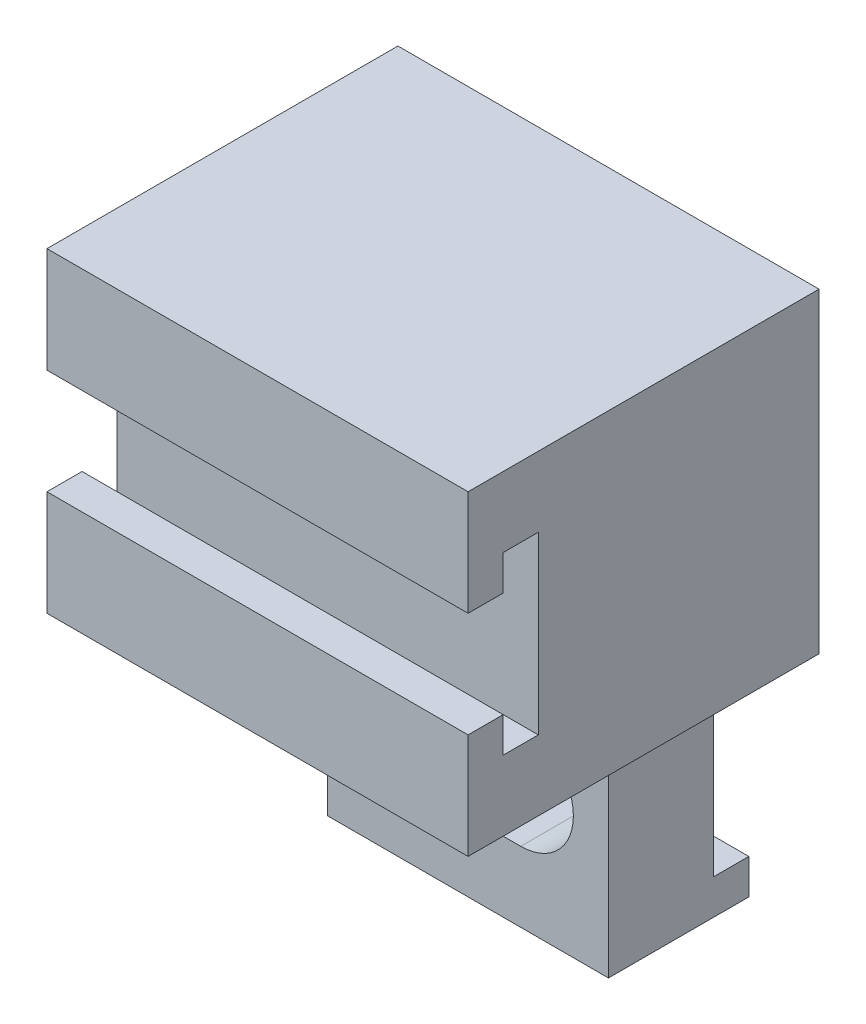
ISO-10303-21;
HEADER;
FILE_DESCRIPTION(('STEP AP214'),'2;1');
FILE_NAME('part.step','',(''),(''),'','','');
FILE_SCHEMA(('AUTOMOTIVE_DESIGN { 1 0 10303 214 1 1 1 1 }'));
ENDSEC;
DATA;
#1=APPLICATION_CONTEXT('core data for automotive mechanical design processes');
#2=APPLICATION_PROTOCOL_DEFINITION('international standard','automotive_design',2000,#1);
#3=PRODUCT_CONTEXT('',#1,'mechanical');
#4=PRODUCT('Part','Part','',(#3));
#5=PRODUCT_RELATED_PRODUCT_CATEGORY('part','',(#4));
#6=PRODUCT_DEFINITION_FORMATION('','',#4);
#7=PRODUCT_DEFINITION_CONTEXT('part definition',#1,'design');
#8=PRODUCT_DEFINITION('design','',#6,#7);
#9=PRODUCT_DEFINITION_SHAPE('','',#8);
#10=(LENGTH_UNIT() NAMED_UNIT(*) SI_UNIT(.MILLI.,.METRE.));
#11=(NAMED_UNIT(*) PLANE_ANGLE_UNIT() SI_UNIT($,.RADIAN.));
#12=(NAMED_UNIT(*) SI_UNIT($,.STERADIAN.) SOLID_ANGLE_UNIT());
#13=UNCERTAINTY_MEASURE_WITH_UNIT(LENGTH_MEASURE(1.E-05),#10,'distance_accuracy_value','');
#14=(GEOMETRIC_REPRESENTATION_CONTEXT(3) GLOBAL_UNCERTAINTY_ASSIGNED_CONTEXT((#13)) GLOBAL_UNIT_ASSIGNED_CONTEXT((#10,
#11,#12)) REPRESENTATION_CONTEXT('',''));
#15=CARTESIAN_POINT('',(0.,0.,0.));
#16=DIRECTION('',(0.,0.,1.));
#17=DIRECTION('',(1.,0.,0.));
#18=AXIS2_PLACEMENT_3D('',#15,#16,#17);
#19=CARTESIAN_POINT('',(60.,0.,100.));
#20=DIRECTION('',(0.,0.,-1.));
#21=DIRECTION('',(-1.,0.,0.));
#22=AXIS2_PLACEMENT_3D('',#19,#20,#21);
#23=PLANE('',#22);
#24=DIRECTION('',(0.,-1.,0.));
#25=VECTOR('',#24,1.);
#26=CARTESIAN_POINT('',(-60.,0.,100.));
#27=LINE('',#26,#25);
#28=CARTESIAN_POINT('',(-60.,100.,100.));
#29=VERTEX_POINT('',#28);
#30=CARTESIAN_POINT('',(-60.,70.,100.));
#31=VERTEX_POINT('',#30);
#32=EDGE_CURVE('E281',#29,#31,#27,.T.);
#33=ORIENTED_EDGE('',*,*,#32,.T.);
#34=DIRECTION('',(-1.,0.,0.));
#35=VECTOR('',#34,1.);
#36=CARTESIAN_POINT('',(60.,70.,100.));
#37=LINE('',#36,#35);
#38=CARTESIAN_POINT('',(60.,70.,100.));
#39=VERTEX_POINT('',#38);
#40=EDGE_CURVE('E366',#39,#31,#37,.T.);
#41=ORIENTED_EDGE('',*,*,#40,.F.);
#42=DIRECTION('',(0.,-1.,0.));
#43=VECTOR('',#42,1.);
#44=CARTESIAN_POINT('',(60.,0.,100.));
#45=LINE('',#44,#43);
#46=CARTESIAN_POINT('',(60.,100.,100.));
#47=VERTEX_POINT('',#46);
#48=EDGE_CURVE('E282',#47,#39,#45,.T.);
#49=ORIENTED_EDGE('',*,*,#48,.F.);
#50=DIRECTION('',(-1.,0.,0.));
#51=VECTOR('',#50,1.);
#52=CARTESIAN_POINT('',(60.,100.,100.));
#53=LINE('',#52,#51);
#54=EDGE_CURVE('E308',#47,#29,#53,.T.);
#55=ORIENTED_EDGE('',*,*,#54,.T.);
#56=EDGE_LOOP('',(#33,#41,#49,#55));
#57=FACE_BOUND('',#56,.T.);
#58=ADVANCED_FACE('F39',(#57),#23,.F.);
#59=CARTESIAN_POINT('',(60.,70.,0.));
#60=DIRECTION('',(0.,1.,0.));
#61=DIRECTION('',(0.,0.,1.));
#62=AXIS2_PLACEMENT_3D('',#59,#60,#61);
#63=PLANE('',#62);
#64=DIRECTION('',(-1.,0.,0.));
#65=VECTOR('',#64,1.);
#66=CARTESIAN_POINT('',(60.,70.,0.));
#67=LINE('',#66,#65);
#68=CARTESIAN_POINT('',(-40.,70.,0.));
#69=VERTEX_POINT('',#68);
#70=CARTESIAN_POINT('',(-60.,70.,0.));
#71=VERTEX_POINT('',#70);
#72=EDGE_CURVE('E362',#69,#71,#67,.T.);
#73=ORIENTED_EDGE('',*,*,#72,.F.);
#74=DIRECTION('',(0.,0.,1.));
#75=VECTOR('',#74,1.);
#76=CARTESIAN_POINT('',(-40.,70.,0.));
#77=LINE('',#76,#75);
#78=CARTESIAN_POINT('',(-40.,70.,40.));
#79=VERTEX_POINT('',#78);
#80=EDGE_CURVE('E228',#69,#79,#77,.T.);
#81=ORIENTED_EDGE('',*,*,#80,.T.);
#82=DIRECTION('',(-1.,0.,0.));
#83=VECTOR('',#82,1.);
#84=CARTESIAN_POINT('',(40.,70.,40.));
#85=LINE('',#84,#83);
#86=CARTESIAN_POINT('',(40.,70.,40.));
#87=VERTEX_POINT('',#86);
#88=EDGE_CURVE('E244',#87,#79,#85,.T.);
#89=ORIENTED_EDGE('',*,*,#88,.F.);
#90=DIRECTION('',(0.,0.,1.));
#91=VECTOR('',#90,1.);
#92=CARTESIAN_POINT('',(40.,70.,0.));
#93=LINE('',#92,#91);
#94=CARTESIAN_POINT('',(40.,70.,0.));
#95=VERTEX_POINT('',#94);
#96=EDGE_CURVE('E241',#95,#87,#93,.T.);
#97=ORIENTED_EDGE('',*,*,#96,.F.);
#98=CARTESIAN_POINT('',(60.,70.,0.));
#99=VERTEX_POINT('',#98);
#100=EDGE_CURVE('E363',#99,#95,#67,.T.);
#101=ORIENTED_EDGE('',*,*,#100,.F.);
#102=DIRECTION('',(0.,0.,-1.));
#103=VECTOR('',#102,1.);
#104=CARTESIAN_POINT('',(60.,70.,0.));
#105=LINE('',#104,#103);
#106=EDGE_CURVE('E285',#39,#99,#105,.T.);
#107=ORIENTED_EDGE('',*,*,#106,.F.);
#108=ORIENTED_EDGE('',*,*,#40,.T.);
#109=DIRECTION('',(0.,0.,-1.));
#110=VECTOR('',#109,1.);
#111=CARTESIAN_POINT('',(-60.,70.,0.));
#112=LINE('',#111,#110);
#113=EDGE_CURVE('E311',#31,#71,#112,.T.);
#114=ORIENTED_EDGE('',*,*,#113,.T.);
#115=EDGE_LOOP('',(#73,#81,#89,#97,#101,#107,#108,#114));
#116=FACE_BOUND('',#115,.T.);
#117=ADVANCED_FACE('F398',(#116),#63,.F.);
#118=CARTESIAN_POINT('',(60.,0.,0.));
#119=DIRECTION('',(0.,0.,1.));
#120=DIRECTION('',(1.,0.,0.));
#121=AXIS2_PLACEMENT_3D('',#118,#119,#120);
#122=PLANE('',#121);
#123=DIRECTION('',(0.,1.,0.));
#124=VECTOR('',#123,1.);
#125=CARTESIAN_POINT('',(-60.,0.,0.));
#126=LINE('',#125,#124);
#127=CARTESIAN_POINT('',(-60.,160.,0.));
#128=VERTEX_POINT('',#127);
#129=EDGE_CURVE('E314',#71,#128,#126,.T.);
#130=ORIENTED_EDGE('',*,*,#129,.T.);
#131=DIRECTION('',(-1.,0.,0.));
#132=VECTOR('',#131,1.);
#133=CARTESIAN_POINT('',(60.,160.,0.));
#134=LINE('',#133,#132);
#135=CARTESIAN_POINT('',(60.,160.,0.));
#136=VERTEX_POINT('',#135);
#137=EDGE_CURVE('E359',#136,#128,#134,.T.);
#138=ORIENTED_EDGE('',*,*,#137,.F.);
#139=DIRECTION('',(0.,1.,0.));
#140=VECTOR('',#139,1.);
#141=CARTESIAN_POINT('',(60.,0.,0.));
#142=LINE('',#141,#140);
#143=EDGE_CURVE('E288',#99,#136,#142,.T.);
#144=ORIENTED_EDGE('',*,*,#143,.F.);
#145=ORIENTED_EDGE('',*,*,#100,.T.);
#146=DIRECTION('',(0.,1.,0.));
#147=VECTOR('',#146,1.);
#148=CARTESIAN_POINT('',(40.,0.,0.));
#149=LINE('',#148,#147);
#150=CARTESIAN_POINT('',(40.,60.,0.));
#151=VERTEX_POINT('',#150);
#152=EDGE_CURVE('E238',#151,#95,#149,.T.);
#153=ORIENTED_EDGE('',*,*,#152,.F.);
#154=DIRECTION('',(-1.,0.,0.));
#155=VECTOR('',#154,1.);
#156=CARTESIAN_POINT('',(40.,60.,0.));
#157=LINE('',#156,#155);
#158=CARTESIAN_POINT('',(-40.,60.,0.));
#159=VERTEX_POINT('',#158);
#160=EDGE_CURVE('E263',#151,#159,#157,.T.);
#161=ORIENTED_EDGE('',*,*,#160,.T.);
#162=DIRECTION('',(0.,1.,0.));
#163=VECTOR('',#162,1.);
#164=CARTESIAN_POINT('',(-40.,0.,0.));
#165=LINE('',#164,#163);
#166=EDGE_CURVE('E257',#159,#69,#165,.T.);
#167=ORIENTED_EDGE('',*,*,#166,.T.);
#168=ORIENTED_EDGE('',*,*,#72,.T.);
#169=EDGE_LOOP('',(#130,#138,#144,#145,#153,#161,#167,#168));
#170=FACE_BOUND('',#169,.T.);
#171=ADVANCED_FACE('F404',(#170),#122,.F.);
#172=CARTESIAN_POINT('',(60.,160.,0.));
#173=DIRECTION('',(0.,-1.,0.));
#174=DIRECTION('',(0.,0.,-1.));
#175=AXIS2_PLACEMENT_3D('',#172,#173,#174);
#176=PLANE('',#175);
#177=DIRECTION('',(0.,0.,1.));
#178=VECTOR('',#177,1.);
#179=CARTESIAN_POINT('',(-60.,160.,0.));
#180=LINE('',#179,#178);
#181=CARTESIAN_POINT('',(-60.,160.,100.));
#182=VERTEX_POINT('',#181);
#183=EDGE_CURVE('E316',#128,#182,#180,.T.);
#184=ORIENTED_EDGE('',*,*,#183,.T.);
#185=DIRECTION('',(-1.,0.,0.));
#186=VECTOR('',#185,1.);
#187=CARTESIAN_POINT('',(60.,160.,100.));
#188=LINE('',#187,#186);
#189=CARTESIAN_POINT('',(60.,160.,100.));
#190=VERTEX_POINT('',#189);
#191=EDGE_CURVE('E356',#190,#182,#188,.T.);
#192=ORIENTED_EDGE('',*,*,#191,.F.);
#193=DIRECTION('',(0.,0.,1.));
#194=VECTOR('',#193,1.);
#195=CARTESIAN_POINT('',(60.,160.,0.));
#196=LINE('',#195,#194);
#197=EDGE_CURVE('E290',#136,#190,#196,.T.);
#198=ORIENTED_EDGE('',*,*,#197,.F.);
#199=ORIENTED_EDGE('',*,*,#137,.T.);
#200=EDGE_LOOP('',(#184,#192,#198,#199));
#201=FACE_BOUND('',#200,.T.);
#202=ADVANCED_FACE('F459',(#201),#176,.F.);
#203=CARTESIAN_POINT('',(60.,0.,100.));
#204=DIRECTION('',(0.,0.,-1.));
#205=DIRECTION('',(-1.,0.,0.));
#206=AXIS2_PLACEMENT_3D('',#203,#204,#205);
#207=PLANE('',#206);
#208=DIRECTION('',(0.,-1.,0.));
#209=VECTOR('',#208,1.);
#210=CARTESIAN_POINT('',(-60.,0.,100.));
#211=LINE('',#210,#209);
#212=CARTESIAN_POINT('',(-60.,130.,100.));
#213=VERTEX_POINT('',#212);
#214=EDGE_CURVE('E318',#182,#213,#211,.T.);
#215=ORIENTED_EDGE('',*,*,#214,.T.);
#216=DIRECTION('',(-1.,0.,0.));
#217=VECTOR('',#216,1.);
#218=CARTESIAN_POINT('',(60.,130.,100.));
#219=LINE('',#218,#217);
#220=CARTESIAN_POINT('',(60.,130.,100.));
#221=VERTEX_POINT('',#220);
#222=EDGE_CURVE('E353',#221,#213,#219,.T.);
#223=ORIENTED_EDGE('',*,*,#222,.F.);
#224=DIRECTION('',(0.,-1.,0.));
#225=VECTOR('',#224,1.);
#226=CARTESIAN_POINT('',(60.,0.,100.));
#227=LINE('',#226,#225);
#228=EDGE_CURVE('E292',#190,#221,#227,.T.);
#229=ORIENTED_EDGE('',*,*,#228,.F.);
#230=ORIENTED_EDGE('',*,*,#191,.T.);
#231=EDGE_LOOP('',(#215,#223,#229,#230));
#232=FACE_BOUND('',#231,.T.);
#233=ADVANCED_FACE('F456',(#232),#207,.F.);
#234=CARTESIAN_POINT('',(60.,130.,0.));
#235=DIRECTION('',(0.,1.,0.));
#236=DIRECTION('',(0.,0.,1.));
#237=AXIS2_PLACEMENT_3D('',#234,#235,#236);
#238=PLANE('',#237);
#239=DIRECTION('',(0.,0.,-1.));
#240=VECTOR('',#239,1.);
#241=CARTESIAN_POINT('',(-60.,130.,0.));
#242=LINE('',#241,#240);
#243=CARTESIAN_POINT('',(-60.,130.,90.));
#244=VERTEX_POINT('',#243);
#245=EDGE_CURVE('E320',#213,#244,#242,.T.);
#246=ORIENTED_EDGE('',*,*,#245,.T.);
#247=DIRECTION('',(-1.,0.,0.));
#248=VECTOR('',#247,1.);
#249=CARTESIAN_POINT('',(60.,130.,90.));
#250=LINE('',#249,#248);
#251=CARTESIAN_POINT('',(60.,130.,90.));
#252=VERTEX_POINT('',#251);
#253=EDGE_CURVE('E350',#252,#244,#250,.T.);
#254=ORIENTED_EDGE('',*,*,#253,.F.);
#255=DIRECTION('',(0.,0.,-1.));
#256=VECTOR('',#255,1.);
#257=CARTESIAN_POINT('',(60.,130.,0.));
#258=LINE('',#257,#256);
#259=EDGE_CURVE('E294',#221,#252,#258,.T.);
#260=ORIENTED_EDGE('',*,*,#259,.F.);
#261=ORIENTED_EDGE('',*,*,#222,.T.);
#262=EDGE_LOOP('',(#246,#254,#260,#261));
#263=FACE_BOUND('',#262,.T.);
#264=ADVANCED_FACE('F452',(#263),#238,.F.);
#265=CARTESIAN_POINT('',(60.,-1.2490009027033E-13,89.9999999999998));
#266=DIRECTION('',(0.,0.,1.));
#267=DIRECTION('',(0.,-1.,0.));
#268=AXIS2_PLACEMENT_3D('',#265,#266,#267);
#269=PLANE('',#268);
#270=DIRECTION('',(0.,1.,0.));
#271=VECTOR('',#270,1.);
#272=CARTESIAN_POINT('',(-60.,-1.2490009027033E-13,89.9999999999998));
#273=LINE('',#272,#271);
#274=CARTESIAN_POINT('',(-60.,140.,90.));
#275=VERTEX_POINT('',#274);
#276=EDGE_CURVE('E322',#244,#275,#273,.T.);
#277=ORIENTED_EDGE('',*,*,#276,.T.);
#278=DIRECTION('',(-1.,0.,0.));
#279=VECTOR('',#278,1.);
#280=CARTESIAN_POINT('',(60.,140.,90.));
#281=LINE('',#280,#279);
#282=CARTESIAN_POINT('',(60.,140.,90.));
#283=VERTEX_POINT('',#282);
#284=EDGE_CURVE('E347',#283,#275,#281,.T.);
#285=ORIENTED_EDGE('',*,*,#284,.F.);
#286=DIRECTION('',(0.,1.,0.));
#287=VECTOR('',#286,1.);
#288=CARTESIAN_POINT('',(60.,-1.2490009027033E-13,89.9999999999998));
#289=LINE('',#288,#287);
#290=EDGE_CURVE('E296',#252,#283,#289,.T.);
#291=ORIENTED_EDGE('',*,*,#290,.F.);
#292=ORIENTED_EDGE('',*,*,#253,.T.);
#293=EDGE_LOOP('',(#277,#285,#291,#292));
#294=FACE_BOUND('',#293,.T.);
#295=ADVANCED_FACE('F447',(#294),#269,.F.);
#296=CARTESIAN_POINT('',(60.,140.,0.));
#297=DIRECTION('',(0.,1.,0.));
#298=DIRECTION('',(0.,0.,1.));
#299=AXIS2_PLACEMENT_3D('',#296,#297,#298);
#300=PLANE('',#299);
#301=DIRECTION('',(0.,0.,-1.));
#302=VECTOR('',#301,1.);
#303=CARTESIAN_POINT('',(-60.,140.,0.));
#304=LINE('',#303,#302);
#305=CARTESIAN_POINT('',(-60.,140.,80.));
#306=VERTEX_POINT('',#305);
#307=EDGE_CURVE('E324',#275,#306,#304,.T.);
#308=ORIENTED_EDGE('',*,*,#307,.T.);
#309=DIRECTION('',(-1.,0.,0.));
#310=VECTOR('',#309,1.);
#311=CARTESIAN_POINT('',(60.,140.,80.));
#312=LINE('',#311,#310);
#313=CARTESIAN_POINT('',(60.,140.,80.));
#314=VERTEX_POINT('',#313);
#315=EDGE_CURVE('E344',#314,#306,#312,.T.);
#316=ORIENTED_EDGE('',*,*,#315,.F.);
#317=DIRECTION('',(0.,0.,-1.));
#318=VECTOR('',#317,1.);
#319=CARTESIAN_POINT('',(60.,140.,0.));
#320=LINE('',#319,#318);
#321=EDGE_CURVE('E298',#283,#314,#320,.T.);
#322=ORIENTED_EDGE('',*,*,#321,.F.);
#323=ORIENTED_EDGE('',*,*,#284,.T.);
#324=EDGE_LOOP('',(#308,#316,#322,#323));
#325=FACE_BOUND('',#324,.T.);
#326=ADVANCED_FACE('F441',(#325),#300,.F.);
#327=CARTESIAN_POINT('',(60.,0.,80.));
#328=DIRECTION('',(0.,0.,-1.));
#329=DIRECTION('',(0.,1.,0.));
#330=AXIS2_PLACEMENT_3D('',#327,#328,#329);
#331=PLANE('',#330);
#332=DIRECTION('',(0.,-1.,0.));
#333=VECTOR('',#332,1.);
#334=CARTESIAN_POINT('',(-60.,0.,80.));
#335=LINE('',#334,#333);
#336=CARTESIAN_POINT('',(-60.,90.,80.));
#337=VERTEX_POINT('',#336);
#338=EDGE_CURVE('E326',#306,#337,#335,.T.);
#339=ORIENTED_EDGE('',*,*,#338,.T.);
#340=DIRECTION('',(-1.,0.,0.));
#341=VECTOR('',#340,1.);
#342=CARTESIAN_POINT('',(60.,90.,80.));
#343=LINE('',#342,#341);
#344=CARTESIAN_POINT('',(60.,90.,80.));
#345=VERTEX_POINT('',#344);
#346=EDGE_CURVE('E341',#345,#337,#343,.T.);
#347=ORIENTED_EDGE('',*,*,#346,.F.);
#348=DIRECTION('',(0.,-1.,0.));
#349=VECTOR('',#348,1.);
#350=CARTESIAN_POINT('',(60.,0.,80.));
#351=LINE('',#350,#349);
#352=EDGE_CURVE('E300',#314,#345,#351,.T.);
#353=ORIENTED_EDGE('',*,*,#352,.F.);
#354=ORIENTED_EDGE('',*,*,#315,.T.);
#355=EDGE_LOOP('',(#339,#347,#353,#354));
#356=FACE_BOUND('',#355,.T.);
#357=ADVANCED_FACE('F437',(#356),#331,.F.);
#358=CARTESIAN_POINT('',(60.,90.,0.));
#359=DIRECTION('',(0.,-1.,0.));
#360=DIRECTION('',(0.,0.,-1.));
#361=AXIS2_PLACEMENT_3D('',#358,#359,#360);
#362=PLANE('',#361);
#363=DIRECTION('',(0.,0.,1.));
#364=VECTOR('',#363,1.);
#365=CARTESIAN_POINT('',(-60.,90.,0.));
#366=LINE('',#365,#364);
#367=CARTESIAN_POINT('',(-60.,90.,90.));
#368=VERTEX_POINT('',#367);
#369=EDGE_CURVE('E328',#337,#368,#366,.T.);
#370=ORIENTED_EDGE('',*,*,#369,.T.);
#371=DIRECTION('',(-1.,0.,0.));
#372=VECTOR('',#371,1.);
#373=CARTESIAN_POINT('',(60.,90.,90.));
#374=LINE('',#373,#372);
#375=CARTESIAN_POINT('',(60.,90.,90.));
#376=VERTEX_POINT('',#375);
#377=EDGE_CURVE('E338',#376,#368,#374,.T.);
#378=ORIENTED_EDGE('',*,*,#377,.F.);
#379=DIRECTION('',(0.,0.,1.));
#380=VECTOR('',#379,1.);
#381=CARTESIAN_POINT('',(60.,90.,0.));
#382=LINE('',#381,#380);
#383=EDGE_CURVE('E302',#345,#376,#382,.T.);
#384=ORIENTED_EDGE('',*,*,#383,.F.);
#385=ORIENTED_EDGE('',*,*,#346,.T.);
#386=EDGE_LOOP('',(#370,#378,#384,#385));
#387=FACE_BOUND('',#386,.T.);
#388=ADVANCED_FACE('F432',(#387),#362,.F.);
#389=CARTESIAN_POINT('',(60.,0.,90.));
#390=DIRECTION('',(0.,0.,1.));
#391=DIRECTION('',(1.,0.,0.));
#392=AXIS2_PLACEMENT_3D('',#389,#390,#391);
#393=PLANE('',#392);
#394=DIRECTION('',(0.,1.,0.));
#395=VECTOR('',#394,1.);
#396=CARTESIAN_POINT('',(-60.,0.,90.));
#397=LINE('',#396,#395);
#398=CARTESIAN_POINT('',(-60.,100.,90.));
#399=VERTEX_POINT('',#398);
#400=EDGE_CURVE('E330',#368,#399,#397,.T.);
#401=ORIENTED_EDGE('',*,*,#400,.T.);
#402=DIRECTION('',(-1.,0.,0.));
#403=VECTOR('',#402,1.);
#404=CARTESIAN_POINT('',(60.,100.,90.));
#405=LINE('',#404,#403);
#406=CARTESIAN_POINT('',(60.,100.,90.));
#407=VERTEX_POINT('',#406);
#408=EDGE_CURVE('E335',#407,#399,#405,.T.);
#409=ORIENTED_EDGE('',*,*,#408,.F.);
#410=DIRECTION('',(0.,1.,0.));
#411=VECTOR('',#410,1.);
#412=CARTESIAN_POINT('',(60.,0.,90.));
#413=LINE('',#412,#411);
#414=EDGE_CURVE('E304',#376,#407,#413,.T.);
#415=ORIENTED_EDGE('',*,*,#414,.F.);
#416=ORIENTED_EDGE('',*,*,#377,.T.);
#417=EDGE_LOOP('',(#401,#409,#415,#416));
#418=FACE_BOUND('',#417,.T.);
#419=ADVANCED_FACE('F426',(#418),#393,.F.);
#420=CARTESIAN_POINT('',(60.,100.,2.7755575615629E-13));
#421=DIRECTION('',(0.,-1.,0.));
#422=DIRECTION('',(0.,0.,-1.));
#423=AXIS2_PLACEMENT_3D('',#420,#421,#422);
#424=PLANE('',#423);
#425=DIRECTION('',(0.,0.,1.));
#426=VECTOR('',#425,1.);
#427=CARTESIAN_POINT('',(-60.,100.,2.7755575615629E-13));
#428=LINE('',#427,#426);
#429=EDGE_CURVE('E286',#399,#29,#428,.T.);
#430=ORIENTED_EDGE('',*,*,#429,.T.);
#431=ORIENTED_EDGE('',*,*,#54,.F.);
#432=DIRECTION('',(0.,0.,1.));
#433=VECTOR('',#432,1.);
#434=CARTESIAN_POINT('',(60.,100.,2.7755575615629E-13));
#435=LINE('',#434,#433);
#436=EDGE_CURVE('E306',#407,#47,#435,.T.);
#437=ORIENTED_EDGE('',*,*,#436,.F.);
#438=ORIENTED_EDGE('',*,*,#408,.T.);
#439=EDGE_LOOP('',(#430,#431,#437,#438));
#440=FACE_BOUND('',#439,.T.);
#441=ADVANCED_FACE('F424',(#440),#424,.F.);
#442=CARTESIAN_POINT('',(60.,0.,0.));
#443=DIRECTION('',(1.,0.,0.));
#444=DIRECTION('',(0.,0.,-1.));
#445=AXIS2_PLACEMENT_3D('',#442,#443,#444);
#446=PLANE('',#445);
#447=ORIENTED_EDGE('',*,*,#48,.T.);
#448=ORIENTED_EDGE('',*,*,#106,.T.);
#449=ORIENTED_EDGE('',*,*,#143,.T.);
#450=ORIENTED_EDGE('',*,*,#197,.T.);
#451=ORIENTED_EDGE('',*,*,#228,.T.);
#452=ORIENTED_EDGE('',*,*,#259,.T.);
#453=ORIENTED_EDGE('',*,*,#290,.T.);
#454=ORIENTED_EDGE('',*,*,#321,.T.);
#455=ORIENTED_EDGE('',*,*,#352,.T.);
#456=ORIENTED_EDGE('',*,*,#383,.T.);
#457=ORIENTED_EDGE('',*,*,#414,.T.);
#458=ORIENTED_EDGE('',*,*,#436,.T.);
#459=EDGE_LOOP('',(#447,#448,#449,#450,#451,#452,#453,#454,#455,#456,#457,#458));
#460=FACE_BOUND('',#459,.T.);
#461=ADVANCED_FACE('F419',(#460),#446,.T.);
#462=CARTESIAN_POINT('',(-60.,0.,0.));
#463=DIRECTION('',(1.,0.,0.));
#464=DIRECTION('',(0.,0.,-1.));
#465=AXIS2_PLACEMENT_3D('',#462,#463,#464);
#466=PLANE('',#465);
#467=ORIENTED_EDGE('',*,*,#32,.F.);
#468=ORIENTED_EDGE('',*,*,#429,.F.);
#469=ORIENTED_EDGE('',*,*,#400,.F.);
#470=ORIENTED_EDGE('',*,*,#369,.F.);
#471=ORIENTED_EDGE('',*,*,#338,.F.);
#472=ORIENTED_EDGE('',*,*,#307,.F.);
#473=ORIENTED_EDGE('',*,*,#276,.F.);
#474=ORIENTED_EDGE('',*,*,#245,.F.);
#475=ORIENTED_EDGE('',*,*,#214,.F.);
#476=ORIENTED_EDGE('',*,*,#183,.F.);
#477=ORIENTED_EDGE('',*,*,#129,.F.);
#478=ORIENTED_EDGE('',*,*,#113,.F.);
#479=EDGE_LOOP('',(#467,#468,#469,#470,#471,#472,#473,#474,#475,#476,#477,#478));
#480=FACE_BOUND('',#479,.T.);
#481=ADVANCED_FACE('F412',(#480),#466,.F.);
#482=CARTESIAN_POINT('',(40.,0.,40.));
#483=DIRECTION('',(0.,0.,-1.));
#484=DIRECTION('',(0.,1.,0.));
#485=AXIS2_PLACEMENT_3D('',#482,#483,#484);
#486=PLANE('',#485);
#487=DIRECTION('',(-1.,0.,0.));
#488=VECTOR('',#487,1.);
#489=CARTESIAN_POINT('',(40.,20.,40.));
#490=LINE('',#489,#488);
#491=CARTESIAN_POINT('',(15.,20.,40.));
#492=VERTEX_POINT('',#491);
#493=CARTESIAN_POINT('',(-15.,20.,40.));
#494=VERTEX_POINT('',#493);
#495=EDGE_CURVE('E196',#492,#494,#490,.T.);
#496=ORIENTED_EDGE('',*,*,#495,.T.);
#497=CARTESIAN_POINT('',(-15.,35.,40.));
#498=DIRECTION('',(0.,0.,-1.));
#499=DIRECTION('',(0.,1.,0.));
#500=AXIS2_PLACEMENT_3D('',#497,#498,#499);
#501=CIRCLE('',#500,15.);
#502=CARTESIAN_POINT('',(-15.,50.,40.));
#503=VERTEX_POINT('',#502);
#504=EDGE_CURVE('E218',#494,#503,#501,.T.);
#505=ORIENTED_EDGE('',*,*,#504,.T.);
#506=DIRECTION('',(1.,0.,0.));
#507=VECTOR('',#506,1.);
#508=CARTESIAN_POINT('',(40.,50.,40.));
#509=LINE('',#508,#507);
#510=CARTESIAN_POINT('',(15.,50.,40.));
#511=VERTEX_POINT('',#510);
#512=EDGE_CURVE('E216',#503,#511,#509,.T.);
#513=ORIENTED_EDGE('',*,*,#512,.T.);
#514=CARTESIAN_POINT('',(15.,35.,40.));
#515=DIRECTION('',(0.,0.,-1.));
#516=DIRECTION('',(0.,1.,0.));
#517=AXIS2_PLACEMENT_3D('',#514,#515,#516);
#518=CIRCLE('',#517,15.);
#519=EDGE_CURVE('E201',#511,#492,#518,.T.);
#520=ORIENTED_EDGE('',*,*,#519,.T.);
#521=EDGE_LOOP('',(#496,#505,#513,#520));
#522=FACE_BOUND('',#521,.T.);
#523=DIRECTION('',(0.,-1.,0.));
#524=VECTOR('',#523,1.);
#525=CARTESIAN_POINT('',(-40.,0.,40.));
#526=LINE('',#525,#524);
#527=CARTESIAN_POINT('',(-40.,0.,40.));
#528=VERTEX_POINT('',#527);
#529=EDGE_CURVE('E223',#79,#528,#526,.T.);
#530=ORIENTED_EDGE('',*,*,#529,.T.);
#531=DIRECTION('',(-1.,0.,0.));
#532=VECTOR('',#531,1.);
#533=CARTESIAN_POINT('',(40.,0.,40.));
#534=LINE('',#533,#532);
#535=CARTESIAN_POINT('',(40.,0.,40.));
#536=VERTEX_POINT('',#535);
#537=EDGE_CURVE('E278',#536,#528,#534,.T.);
#538=ORIENTED_EDGE('',*,*,#537,.F.);
#539=DIRECTION('',(0.,-1.,0.));
#540=VECTOR('',#539,1.);
#541=CARTESIAN_POINT('',(40.,0.,40.));
#542=LINE('',#541,#540);
#543=EDGE_CURVE('E224',#87,#536,#542,.T.);
#544=ORIENTED_EDGE('',*,*,#543,.F.);
#545=ORIENTED_EDGE('',*,*,#88,.T.);
#546=EDGE_LOOP('',(#530,#538,#544,#545));
#547=FACE_BOUND('',#546,.T.);
#548=ADVANCED_FACE('F214',(#522,#547),#486,.F.);
#549=CARTESIAN_POINT('',(40.,0.,0.));
#550=DIRECTION('',(0.,1.,0.));
#551=DIRECTION('',(0.,0.,1.));
#552=AXIS2_PLACEMENT_3D('',#549,#550,#551);
#553=PLANE('',#552);
#554=DIRECTION('',(0.,0.,-1.));
#555=VECTOR('',#554,1.);
#556=CARTESIAN_POINT('',(-40.,0.,0.));
#557=LINE('',#556,#555);
#558=CARTESIAN_POINT('',(-40.,0.,0.));
#559=VERTEX_POINT('',#558);
#560=EDGE_CURVE('E247',#528,#559,#557,.T.);
#561=ORIENTED_EDGE('',*,*,#560,.T.);
#562=DIRECTION('',(-1.,0.,0.));
#563=VECTOR('',#562,1.);
#564=CARTESIAN_POINT('',(40.,0.,0.));
#565=LINE('',#564,#563);
#566=CARTESIAN_POINT('',(40.,0.,0.));
#567=VERTEX_POINT('',#566);
#568=EDGE_CURVE('E275',#567,#559,#565,.T.);
#569=ORIENTED_EDGE('',*,*,#568,.F.);
#570=DIRECTION('',(0.,0.,-1.));
#571=VECTOR('',#570,1.);
#572=CARTESIAN_POINT('',(40.,0.,0.));
#573=LINE('',#572,#571);
#574=EDGE_CURVE('E227',#536,#567,#573,.T.);
#575=ORIENTED_EDGE('',*,*,#574,.F.);
#576=ORIENTED_EDGE('',*,*,#537,.T.);
#577=EDGE_LOOP('',(#561,#569,#575,#576));
#578=FACE_BOUND('',#577,.T.);
#579=ADVANCED_FACE('F472',(#578),#553,.F.);
#580=CARTESIAN_POINT('',(40.,0.,0.));
#581=DIRECTION('',(0.,0.,1.));
#582=DIRECTION('',(1.,0.,0.));
#583=AXIS2_PLACEMENT_3D('',#580,#581,#582);
#584=PLANE('',#583);
#585=DIRECTION('',(0.,1.,0.));
#586=VECTOR('',#585,1.);
#587=CARTESIAN_POINT('',(-40.,0.,0.));
#588=LINE('',#587,#586);
#589=CARTESIAN_POINT('',(-40.,10.,0.));
#590=VERTEX_POINT('',#589);
#591=EDGE_CURVE('E249',#559,#590,#588,.T.);
#592=ORIENTED_EDGE('',*,*,#591,.T.);
#593=DIRECTION('',(-1.,0.,0.));
#594=VECTOR('',#593,1.);
#595=CARTESIAN_POINT('',(40.,10.,0.));
#596=LINE('',#595,#594);
#597=CARTESIAN_POINT('',(40.,10.,0.));
#598=VERTEX_POINT('',#597);
#599=EDGE_CURVE('E272',#598,#590,#596,.T.);
#600=ORIENTED_EDGE('',*,*,#599,.F.);
#601=DIRECTION('',(0.,1.,0.));
#602=VECTOR('',#601,1.);
#603=CARTESIAN_POINT('',(40.,0.,0.));
#604=LINE('',#603,#602);
#605=EDGE_CURVE('E230',#567,#598,#604,.T.);
#606=ORIENTED_EDGE('',*,*,#605,.F.);
#607=ORIENTED_EDGE('',*,*,#568,.T.);
#608=EDGE_LOOP('',(#592,#600,#606,#607));
#609=FACE_BOUND('',#608,.T.);
#610=ADVANCED_FACE('F490',(#609),#584,.F.);
#611=CARTESIAN_POINT('',(40.,10.,0.));
#612=DIRECTION('',(0.,-1.,0.));
#613=DIRECTION('',(0.,0.,-1.));
#614=AXIS2_PLACEMENT_3D('',#611,#612,#613);
#615=PLANE('',#614);
#616=DIRECTION('',(0.,0.,1.));
#617=VECTOR('',#616,1.);
#618=CARTESIAN_POINT('',(-40.,10.,0.));
#619=LINE('',#618,#617);
#620=CARTESIAN_POINT('',(-40.,10.,10.));
#621=VERTEX_POINT('',#620);
#622=EDGE_CURVE('E251',#590,#621,#619,.T.);
#623=ORIENTED_EDGE('',*,*,#622,.T.);
#624=DIRECTION('',(-1.,0.,0.));
#625=VECTOR('',#624,1.);
#626=CARTESIAN_POINT('',(40.,10.,10.));
#627=LINE('',#626,#625);
#628=CARTESIAN_POINT('',(40.,10.,10.));
#629=VERTEX_POINT('',#628);
#630=EDGE_CURVE('E269',#629,#621,#627,.T.);
#631=ORIENTED_EDGE('',*,*,#630,.F.);
#632=DIRECTION('',(0.,0.,1.));
#633=VECTOR('',#632,1.);
#634=CARTESIAN_POINT('',(40.,10.,0.));
#635=LINE('',#634,#633);
#636=EDGE_CURVE('E232',#598,#629,#635,.T.);
#637=ORIENTED_EDGE('',*,*,#636,.F.);
#638=ORIENTED_EDGE('',*,*,#599,.T.);
#639=EDGE_LOOP('',(#623,#631,#637,#638));
#640=FACE_BOUND('',#639,.T.);
#641=ADVANCED_FACE('F487',(#640),#615,.F.);
#642=CARTESIAN_POINT('',(40.,0.,10.));
#643=DIRECTION('',(0.,0.,1.));
#644=DIRECTION('',(1.,0.,0.));
#645=AXIS2_PLACEMENT_3D('',#642,#643,#644);
#646=PLANE('',#645);
#647=DIRECTION('',(-1.,0.,0.));
#648=VECTOR('',#647,1.);
#649=CARTESIAN_POINT('',(40.,50.,10.));
#650=LINE('',#649,#648);
#651=CARTESIAN_POINT('',(15.,50.,10.));
#652=VERTEX_POINT('',#651);
#653=CARTESIAN_POINT('',(-15.,50.,10.));
#654=VERTEX_POINT('',#653);
#655=EDGE_CURVE('E46',#652,#654,#650,.T.);
#656=ORIENTED_EDGE('',*,*,#655,.T.);
#657=CARTESIAN_POINT('',(-15.,35.,10.));
#658=DIRECTION('',(0.,0.,1.));
#659=DIRECTION('',(1.,0.,0.));
#660=AXIS2_PLACEMENT_3D('',#657,#658,#659);
#661=CIRCLE('',#660,15.);
#662=CARTESIAN_POINT('',(-15.,20.,10.));
#663=VERTEX_POINT('',#662);
#664=EDGE_CURVE('E11',#654,#663,#661,.T.);
#665=ORIENTED_EDGE('',*,*,#664,.T.);
#666=DIRECTION('',(1.,0.,0.));
#667=VECTOR('',#666,1.);
#668=CARTESIAN_POINT('',(40.,20.,10.));
#669=LINE('',#668,#667);
#670=CARTESIAN_POINT('',(15.,20.,10.));
#671=VERTEX_POINT('',#670);
#672=EDGE_CURVE('E369',#663,#671,#669,.T.);
#673=ORIENTED_EDGE('',*,*,#672,.T.);
#674=CARTESIAN_POINT('',(15.,35.,10.));
#675=DIRECTION('',(0.,0.,1.));
#676=DIRECTION('',(1.,0.,0.));
#677=AXIS2_PLACEMENT_3D('',#674,#675,#676);
#678=CIRCLE('',#677,15.);
#679=EDGE_CURVE('E209',#671,#652,#678,.T.);
#680=ORIENTED_EDGE('',*,*,#679,.T.);
#681=EDGE_LOOP('',(#656,#665,#673,#680));
#682=FACE_BOUND('',#681,.T.);
#683=DIRECTION('',(0.,1.,0.));
#684=VECTOR('',#683,1.);
#685=CARTESIAN_POINT('',(-40.,0.,10.));
#686=LINE('',#685,#684);
#687=CARTESIAN_POINT('',(-40.,60.,10.));
#688=VERTEX_POINT('',#687);
#689=EDGE_CURVE('E253',#621,#688,#686,.T.);
#690=ORIENTED_EDGE('',*,*,#689,.T.);
#691=DIRECTION('',(-1.,0.,0.));
#692=VECTOR('',#691,1.);
#693=CARTESIAN_POINT('',(40.,60.,10.));
#694=LINE('',#693,#692);
#695=CARTESIAN_POINT('',(40.,60.,10.));
#696=VERTEX_POINT('',#695);
#697=EDGE_CURVE('E266',#696,#688,#694,.T.);
#698=ORIENTED_EDGE('',*,*,#697,.F.);
#699=DIRECTION('',(0.,1.,0.));
#700=VECTOR('',#699,1.);
#701=CARTESIAN_POINT('',(40.,0.,10.));
#702=LINE('',#701,#700);
#703=EDGE_CURVE('E234',#629,#696,#702,.T.);
#704=ORIENTED_EDGE('',*,*,#703,.F.);
#705=ORIENTED_EDGE('',*,*,#630,.T.);
#706=EDGE_LOOP('',(#690,#698,#704,#705));
#707=FACE_BOUND('',#706,.T.);
#708=ADVANCED_FACE('F373',(#682,#707),#646,.F.);
#709=CARTESIAN_POINT('',(40.,60.,0.));
#710=DIRECTION('',(0.,1.,0.));
#711=DIRECTION('',(0.,0.,1.));
#712=AXIS2_PLACEMENT_3D('',#709,#710,#711);
#713=PLANE('',#712);
#714=DIRECTION('',(0.,0.,-1.));
#715=VECTOR('',#714,1.);
#716=CARTESIAN_POINT('',(-40.,60.,0.));
#717=LINE('',#716,#715);
#718=EDGE_CURVE('E255',#688,#159,#717,.T.);
#719=ORIENTED_EDGE('',*,*,#718,.T.);
#720=ORIENTED_EDGE('',*,*,#160,.F.);
#721=DIRECTION('',(0.,0.,-1.));
#722=VECTOR('',#721,1.);
#723=CARTESIAN_POINT('',(40.,60.,0.));
#724=LINE('',#723,#722);
#725=EDGE_CURVE('E236',#696,#151,#724,.T.);
#726=ORIENTED_EDGE('',*,*,#725,.F.);
#727=ORIENTED_EDGE('',*,*,#697,.T.);
#728=EDGE_LOOP('',(#719,#720,#726,#727));
#729=FACE_BOUND('',#728,.T.);
#730=ADVANCED_FACE('F481',(#729),#713,.F.);
#731=CARTESIAN_POINT('',(40.,0.,0.));
#732=DIRECTION('',(1.,0.,0.));
#733=DIRECTION('',(0.,0.,-1.));
#734=AXIS2_PLACEMENT_3D('',#731,#732,#733);
#735=PLANE('',#734);
#736=ORIENTED_EDGE('',*,*,#543,.T.);
#737=ORIENTED_EDGE('',*,*,#574,.T.);
#738=ORIENTED_EDGE('',*,*,#605,.T.);
#739=ORIENTED_EDGE('',*,*,#636,.T.);
#740=ORIENTED_EDGE('',*,*,#703,.T.);
#741=ORIENTED_EDGE('',*,*,#725,.T.);
#742=ORIENTED_EDGE('',*,*,#152,.T.);
#743=ORIENTED_EDGE('',*,*,#96,.T.);
#744=EDGE_LOOP('',(#736,#737,#738,#739,#740,#741,#742,#743));
#745=FACE_BOUND('',#744,.T.);
#746=ADVANCED_FACE('F392',(#745),#735,.T.);
#747=CARTESIAN_POINT('',(-40.,0.,0.));
#748=DIRECTION('',(1.,0.,0.));
#749=DIRECTION('',(0.,0.,-1.));
#750=AXIS2_PLACEMENT_3D('',#747,#748,#749);
#751=PLANE('',#750);
#752=ORIENTED_EDGE('',*,*,#529,.F.);
#753=ORIENTED_EDGE('',*,*,#80,.F.);
#754=ORIENTED_EDGE('',*,*,#166,.F.);
#755=ORIENTED_EDGE('',*,*,#718,.F.);
#756=ORIENTED_EDGE('',*,*,#689,.F.);
#757=ORIENTED_EDGE('',*,*,#622,.F.);
#758=ORIENTED_EDGE('',*,*,#591,.F.);
#759=ORIENTED_EDGE('',*,*,#560,.F.);
#760=EDGE_LOOP('',(#752,#753,#754,#755,#756,#757,#758,#759));
#761=FACE_BOUND('',#760,.T.);
#762=ADVANCED_FACE('F384',(#761),#751,.F.);
#763=CARTESIAN_POINT('',(-15.,35.,0.));
#764=DIRECTION('',(0.,0.,1.));
#765=DIRECTION('',(1.,0.,0.));
#766=AXIS2_PLACEMENT_3D('',#763,#764,#765);
#767=CYLINDRICAL_SURFACE('',#766,15.);
#768=DIRECTION('',(0.,0.,1.));
#769=VECTOR('',#768,1.);
#770=CARTESIAN_POINT('',(-15.,20.,0.));
#771=LINE('',#770,#769);
#772=EDGE_CURVE('E53',#663,#494,#771,.T.);
#773=ORIENTED_EDGE('',*,*,#772,.F.);
#774=ORIENTED_EDGE('',*,*,#664,.F.);
#775=DIRECTION('',(0.,0.,1.));
#776=VECTOR('',#775,1.);
#777=CARTESIAN_POINT('',(-15.,50.,0.));
#778=LINE('',#777,#776);
#779=EDGE_CURVE('E202',#654,#503,#778,.T.);
#780=ORIENTED_EDGE('',*,*,#779,.T.);
#781=ORIENTED_EDGE('',*,*,#504,.F.);
#782=EDGE_LOOP('',(#773,#774,#780,#781));
#783=FACE_BOUND('',#782,.T.);
#784=ADVANCED_FACE('F382',(#783),#767,.F.);
#785=CARTESIAN_POINT('',(-15.,50.,0.));
#786=DIRECTION('',(0.,1.,0.));
#787=DIRECTION('',(0.,0.,1.));
#788=AXIS2_PLACEMENT_3D('',#785,#786,#787);
#789=PLANE('',#788);
#790=ORIENTED_EDGE('',*,*,#779,.F.);
#791=ORIENTED_EDGE('',*,*,#655,.F.);
#792=DIRECTION('',(0.,0.,1.));
#793=VECTOR('',#792,1.);
#794=CARTESIAN_POINT('',(15.,50.,0.));
#795=LINE('',#794,#793);
#796=EDGE_CURVE('E211',#652,#511,#795,.T.);
#797=ORIENTED_EDGE('',*,*,#796,.T.);
#798=ORIENTED_EDGE('',*,*,#512,.F.);
#799=EDGE_LOOP('',(#790,#791,#797,#798));
#800=FACE_BOUND('',#799,.T.);
#801=ADVANCED_FACE('F377',(#800),#789,.F.);
#802=CARTESIAN_POINT('',(15.,35.,0.));
#803=DIRECTION('',(0.,0.,1.));
#804=DIRECTION('',(1.,0.,0.));
#805=AXIS2_PLACEMENT_3D('',#802,#803,#804);
#806=CYLINDRICAL_SURFACE('',#805,15.);
#807=ORIENTED_EDGE('',*,*,#796,.F.);
#808=ORIENTED_EDGE('',*,*,#679,.F.);
#809=DIRECTION('',(0.,0.,1.));
#810=VECTOR('',#809,1.);
#811=CARTESIAN_POINT('',(15.,20.,0.));
#812=LINE('',#811,#810);
#813=EDGE_CURVE('E58',#671,#492,#812,.T.);
#814=ORIENTED_EDGE('',*,*,#813,.T.);
#815=ORIENTED_EDGE('',*,*,#519,.F.);
#816=EDGE_LOOP('',(#807,#808,#814,#815));
#817=FACE_BOUND('',#816,.T.);
#818=ADVANCED_FACE('F206',(#817),#806,.F.);
#819=CARTESIAN_POINT('',(-15.,20.,0.));
#820=DIRECTION('',(0.,-1.,0.));
#821=DIRECTION('',(0.,0.,-1.));
#822=AXIS2_PLACEMENT_3D('',#819,#820,#821);
#823=PLANE('',#822);
#824=ORIENTED_EDGE('',*,*,#813,.F.);
#825=ORIENTED_EDGE('',*,*,#672,.F.);
#826=ORIENTED_EDGE('',*,*,#772,.T.);
#827=ORIENTED_EDGE('',*,*,#495,.F.);
#828=EDGE_LOOP('',(#824,#825,#826,#827));
#829=FACE_BOUND('',#828,.T.);
#830=ADVANCED_FACE('F197',(#829),#823,.F.);
#831=CLOSED_SHELL('',(#58,#117,#171,#202,#233,#264,#295,#326,#357,#388,#419,#441,#461,#481,#548,
#579,#610,#641,#708,#730,#746,#762,#784,#801,#818,#830));
#832=MANIFOLD_SOLID_BREP('B2',#831);
#833=ADVANCED_BREP_SHAPE_REPRESENTATION('',(#18,#832),#14);
#834=SHAPE_DEFINITION_REPRESENTATION(#9,#833);
ENDSEC;
END-ISO-10303-21;
